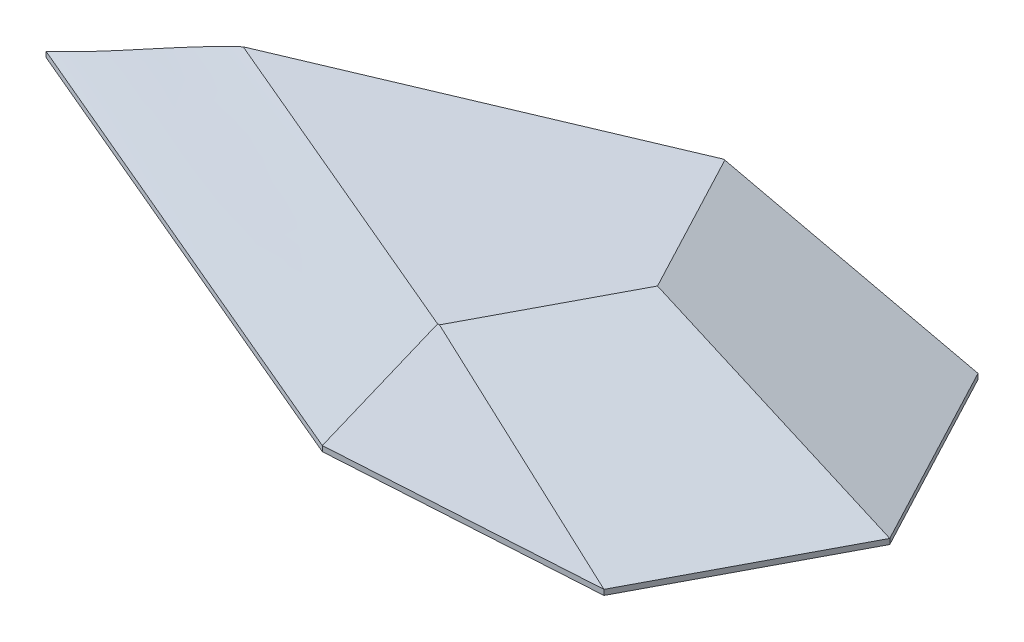
ISO-10303-21;
HEADER;
FILE_DESCRIPTION(('STEP AP214'),'2;1');
FILE_NAME('part.step','',(''),(''),'','','');
FILE_SCHEMA(('AUTOMOTIVE_DESIGN { 1 0 10303 214 1 1 1 1 }'));
ENDSEC;
DATA;
#1=APPLICATION_CONTEXT('core data for automotive mechanical design processes');
#2=APPLICATION_PROTOCOL_DEFINITION('international standard','automotive_design',2000,#1);
#3=PRODUCT_CONTEXT('',#1,'mechanical');
#4=PRODUCT('Part','Part','',(#3));
#5=PRODUCT_RELATED_PRODUCT_CATEGORY('part','',(#4));
#6=PRODUCT_DEFINITION_FORMATION('','',#4);
#7=PRODUCT_DEFINITION_CONTEXT('part definition',#1,'design');
#8=PRODUCT_DEFINITION('design','',#6,#7);
#9=PRODUCT_DEFINITION_SHAPE('','',#8);
#10=(LENGTH_UNIT() NAMED_UNIT(*) SI_UNIT(.MILLI.,.METRE.));
#11=(NAMED_UNIT(*) PLANE_ANGLE_UNIT() SI_UNIT($,.RADIAN.));
#12=(NAMED_UNIT(*) SI_UNIT($,.STERADIAN.) SOLID_ANGLE_UNIT());
#13=UNCERTAINTY_MEASURE_WITH_UNIT(LENGTH_MEASURE(1.E-05),#10,'distance_accuracy_value','');
#14=(GEOMETRIC_REPRESENTATION_CONTEXT(3) GLOBAL_UNCERTAINTY_ASSIGNED_CONTEXT((#13)) GLOBAL_UNIT_ASSIGNED_CONTEXT((#10,
#11,#12)) REPRESENTATION_CONTEXT('',''));
#15=CARTESIAN_POINT('',(0.,0.,0.));
#16=DIRECTION('',(0.,0.,1.));
#17=DIRECTION('',(1.,0.,0.));
#18=AXIS2_PLACEMENT_3D('',#15,#16,#17);
#19=CARTESIAN_POINT('',(362.42570276207,-41.3373029449135,-223.487058966441));
#20=DIRECTION('',(0.0534934352326515,0.486586222198688,-0.871993291690607));
#21=DIRECTION('',(-0.998123619113036,0.,-0.0612310457912873));
#22=AXIS2_PLACEMENT_3D('',#19,#20,#21);
#23=PLANE('',#22);
#24=DIRECTION('',(-0.998123619113036,0.,-0.0612310457912873));
#25=VECTOR('',#24,1.);
#26=CARTESIAN_POINT('',(358.252081405271,81.0426755838166,-155.453106587866));
#27=LINE('',#26,#25);
#28=CARTESIAN_POINT('',(113.027514619091,81.0426755838166,-170.496690759711));
#29=VERTEX_POINT('',#28);
#30=CARTESIAN_POINT('',(110.899403480824,81.0426755838165,-170.627242194484));
#31=VERTEX_POINT('',#30);
#32=EDGE_CURVE('E585',#29,#31,#27,.T.);
#33=ORIENTED_EDGE('',*,*,#32,.F.);
#34=DIRECTION('',(-0.881842315506764,0.432721041163193,0.187367636256402));
#35=VECTOR('',#34,1.);
#36=CARTESIAN_POINT('',(236.883580608468,20.2663611715273,-196.812754201405));
#37=LINE('',#36,#35);
#38=CARTESIAN_POINT('',(362.42570276207,-41.3373029449136,-223.487058966441));
#39=VERTEX_POINT('',#38);
#40=EDGE_CURVE('E484',#39,#29,#37,.T.);
#41=ORIENTED_EDGE('',*,*,#40,.F.);
#42=DIRECTION('',(-0.998123619113036,0.,-0.0612310457912869));
#43=VECTOR('',#42,1.);
#44=CARTESIAN_POINT('',(203.968591934079,-41.3373029449135,-233.207793375758));
#45=LINE('',#44,#43);
#46=CARTESIAN_POINT('',(45.5114811060888,-41.3373029449135,-242.928527785075));
#47=VERTEX_POINT('',#46);
#48=EDGE_CURVE('E635',#39,#47,#45,.T.);
#49=ORIENTED_EDGE('',*,*,#48,.T.);
#50=DIRECTION('',(0.417919448130897,0.782177674890607,0.462105420631149));
#51=VECTOR('',#50,1.);
#52=CARTESIAN_POINT('',(78.4264697804776,20.2663611715273,-206.533488610722));
#53=LINE('',#52,#51);
#54=EDGE_CURVE('E654',#47,#31,#53,.T.);
#55=ORIENTED_EDGE('',*,*,#54,.T.);
#56=EDGE_LOOP('',(#33,#41,#49,#55));
#57=FACE_BOUND('',#56,.T.);
#58=ADVANCED_FACE('F472',(#57),#23,.T.);
#59=CARTESIAN_POINT('',(45.5114811060888,-41.3373029449135,-242.928527785075));
#60=CARTESIAN_POINT('',(67.4548068890146,-0.26819353395294,-218.665168335506));
#61=CARTESIAN_POINT('',(89.3981326719406,40.8009158770076,-194.401808885937));
#62=CARTESIAN_POINT('',(111.341458454867,81.8700252879682,-170.138449436368));
#63=CARTESIAN_POINT('',(-146.441772198282,-41.3373029449135,-161.562351746702));
#64=CARTESIAN_POINT('',(-101.19971153411,-0.0922159086649384,-145.810640965388));
#65=CARTESIAN_POINT('',(-67.5045576860156,41.2000855543382,-128.787343628879));
#66=CARTESIAN_POINT('',(-22.2624970218436,82.4451725905868,-113.035632847564));
#67=CARTESIAN_POINT('',(-338.395025502652,-41.3373029449136,-80.1961757083293));
#68=CARTESIAN_POINT('',(-270.078896235771,0.0878809751256608,-73.0015327638917));
#69=CARTESIAN_POINT('',(-224.182581765434,41.5951359731661,-63.1274592031982));
#70=CARTESIAN_POINT('',(-155.866452498554,83.0203198932053,-55.9328162587606));
#71=CARTESIAN_POINT('',(-530.348278807022,-41.3373029449135,1.17000033004339));
#72=CARTESIAN_POINT('',(-438.988340165455,0.268532662169897,-0.198541853289494));
#73=CARTESIAN_POINT('',(-380.830346616831,41.9896315887404,2.53854251337623));
#74=CARTESIAN_POINT('',(-289.470407975264,83.5954671958239,1.17000033004338));
#75=B_SPLINE_SURFACE_WITH_KNOTS('',3,3,((#59,#60,#61,#62),(#63,#64,#65,#66),(#67,#68,#69,#70),
(#71,#72,#73,#74)),.UNSPECIFIED.,.F.,.F.,.F.,(4,4),(4,4),(0.,1.),(0.,1.),.UNSPECIFIED.);
#76=CARTESIAN_POINT('',(110.899403480824,81.0426755838166,-170.627242194484));
#77=CARTESIAN_POINT('',(87.7890348500212,81.0426755838166,-160.835246797552));
#78=CARTESIAN_POINT('',(64.678184130509,81.0426755838166,-151.044389238637));
#79=CARTESIAN_POINT('',(18.455589116889,81.0426755838165,-131.46478372151));
#80=CARTESIAN_POINT('',(-4.65615517721749,81.0426755838165,-121.676035763294));
#81=CARTESIAN_POINT('',(-50.0390739427923,81.0426755838165,-102.456805146902));
#82=CARTESIAN_POINT('',(-72.3102189969449,81.0426755838165,-93.026253024087));
#83=CARTESIAN_POINT('',(-116.853227402788,81.0426755838166,-74.1668452486426));
#84=CARTESIAN_POINT('',(-139.125090754479,81.0426755838166,-64.7379895960142));
#85=CARTESIAN_POINT('',(-183.669500486234,81.0426755838166,-45.8818904599587));
#86=CARTESIAN_POINT('',(-205.942046866314,81.0426755838166,-36.4546469765675));
#87=CARTESIAN_POINT('',(-250.487800851776,81.0426755838166,-17.6017224351781));
#88=CARTESIAN_POINT('',(-272.761008457157,81.0426755838166,-8.17604137717781));
#89=CARTESIAN_POINT('',(-295.034536050337,81.0426755838166,1.2488834571954));
#90=B_SPLINE_CURVE_WITH_KNOTS('',3,(#76,#77,#78,#79,#80,#81,#82,#83,#84,#85,#86,#87,#88,#89),
.UNSPECIFIED.,.F.,.F.,(4,2,2,2,2,2,4),(0.,75.297747644846,150.595495173112,223.152045034698,
295.708594945292,368.265146467789,440.82169789483),.UNSPECIFIED.);
#91=CARTESIAN_POINT('',(-291.846790189677,81.0426755838165,-0.0999996698296255));
#92=VERTEX_POINT('',#91);
#93=EDGE_CURVE('E597',#31,#92,#90,.T.);
#94=DIRECTION('',(-0.920699932144452,0.,0.390271232541166));
#95=VECTOR('',#94,1.);
#96=CARTESIAN_POINT('',(-242.418398850467,-41.3373029449135,-120.879263727516));
#97=LINE('',#96,#95);
#98=CARTESIAN_POINT('',(-527.35218579189,-41.3373029449135,-0.0999996699566131));
#99=VERTEX_POINT('',#98);
#100=EDGE_CURVE('E650',#47,#99,#97,.T.);
#101=CARTESIAN_POINT('',(-286.498977954968,83.5826755838166,-0.0999996699566207));
#102=CARTESIAN_POINT('',(-289.337557373538,82.2417717446035,-0.0999996699566228));
#103=CARTESIAN_POINT('',(-292.171617321292,80.8913122355324,-0.0999996699566236));
#104=CARTESIAN_POINT('',(-297.83075733858,78.1720316805138,-0.0999996699566243));
#105=CARTESIAN_POINT('',(-300.655837809133,76.8032114692112,-0.099999669956624));
#106=CARTESIAN_POINT('',(-306.29726921497,74.0478698700869,-0.0999996699566239));
#107=CARTESIAN_POINT('',(-309.113620352631,72.661348896503,-0.0999996699566239));
#108=CARTESIAN_POINT('',(-314.737917368916,69.8714100504033,-0.099999669956624));
#109=CARTESIAN_POINT('',(-317.545863299294,68.4679922821956,-0.0999996699566239));
#110=CARTESIAN_POINT('',(-323.15265480242,65.6457190182286,-0.099999669956624));
#111=CARTESIAN_POINT('',(-325.95150341148,64.2268695527513,-0.0999996699566241));
#112=CARTESIAN_POINT('',(-331.541616542959,61.3742527946411,-0.0999996699566238));
#113=CARTESIAN_POINT('',(-334.332880998744,59.9404853714686,-0.0999996699566233));
#114=CARTESIAN_POINT('',(-339.908330365633,57.0592049889799,-0.0999996699566246));
#115=CARTESIAN_POINT('',(-342.692515223967,55.6116919275832,-0.0999996699566264));
#116=CARTESIAN_POINT('',(-348.254375814456,52.7042211538622,-0.0999996699566215));
#117=CARTESIAN_POINT('',(-351.032051547964,51.2442634441225,-0.0999996699566149));
#118=CARTESIAN_POINT('',(-357.505850999344,47.825139547303,-0.0999996699566124));
#119=CARTESIAN_POINT('',(-361.199706718657,45.8616797073128,-0.0999996699566208));
#120=CARTESIAN_POINT('',(-368.578827955461,41.9187422453314,-0.0999996699566271));
#121=CARTESIAN_POINT('',(-372.264093513919,39.9392646999309,-0.0999996699566248));
#122=CARTESIAN_POINT('',(-379.628068614689,35.9682023348251,-0.0999996699566231));
#123=CARTESIAN_POINT('',(-383.306778187115,33.9766175709217,-0.0999996699566236));
#124=CARTESIAN_POINT('',(-390.660210306421,29.9852938321666,-0.0999996699566243));
#125=CARTESIAN_POINT('',(-394.33493245017,27.9855541153322,-0.0999996699566247));
#126=CARTESIAN_POINT('',(-401.682400290076,23.9824183164254,-0.0999996699566232));
#127=CARTESIAN_POINT('',(-405.355145979145,21.9790222213513,-0.0999996699566215));
#128=CARTESIAN_POINT('',(-412.70111400797,17.9729472618005,-0.0999996699566264));
#129=CARTESIAN_POINT('',(-416.374336355213,15.970268411107,-0.0999996699566331));
#130=CARTESIAN_POINT('',(-425.93972162455,10.763875090115,-0.0999996699566371));
#131=CARTESIAN_POINT('',(-431.834106576165,7.56422838178462,-0.0999996699566264));
#132=CARTESIAN_POINT('',(-440.688154784098,2.78797135545785,-0.0999996699566228));
#133=CARTESIAN_POINT('',(-443.641559275978,1.19976697078945,-0.0999996699566236));
#134=CARTESIAN_POINT('',(-449.553608495184,-1.96685595183149,-0.0999996699566243));
#135=CARTESIAN_POINT('',(-452.512253217053,-3.54527449996408,-0.099999669956624));
#136=CARTESIAN_POINT('',(-458.435642510543,-6.69029304012856,-0.0999996699566239));
#137=CARTESIAN_POINT('',(-461.400386788985,-8.25689358405355,-0.0999996699566239));
#138=CARTESIAN_POINT('',(-467.337003780836,-11.3765349505384,-0.099999669956624));
#139=CARTESIAN_POINT('',(-470.308876493506,-12.9295757745036,-0.099999669956624));
#140=CARTESIAN_POINT('',(-476.261104773701,-16.0207334267694,-0.099999669956624));
#141=CARTESIAN_POINT('',(-479.241461867384,-17.558847317595,-0.099999669956624));
#142=CARTESIAN_POINT('',(-485.210747442042,-20.6183501038834,-0.099999669956624));
#143=CARTESIAN_POINT('',(-488.19967591379,-22.1397390173456,-0.0999996699566239));
#144=CARTESIAN_POINT('',(-494.18686060417,-25.1645783300111,-0.099999669956624));
#145=CARTESIAN_POINT('',(-497.185117458325,-26.6680274717172,-0.099999669956624));
#146=CARTESIAN_POINT('',(-503.191173385444,-29.6557391531355,-0.0999996699566239));
#147=CARTESIAN_POINT('',(-506.198972446639,-31.1400017165006,-0.0999996699566237));
#148=CARTESIAN_POINT('',(-512.225114082246,-34.088702184269,-0.0999996699566243));
#149=CARTESIAN_POINT('',(-515.243458876339,-35.5531355537402,-0.0999996699566251));
#150=CARTESIAN_POINT('',(-521.290223133845,-38.4610921083974,-0.0999996699566228));
#151=CARTESIAN_POINT('',(-524.31864265049,-39.9046151828858,-0.0999996699566198));
#152=CARTESIAN_POINT('',(-527.35218579189,-41.3373029449135,-0.0999996699566123));
#153=B_SPLINE_CURVE_WITH_KNOTS('',3,(#101,#102,#103,#104,#105,#106,#107,#108,#109,#110,#111,
#112,#113,#114,#115,#116,#117,#118,#119,#120,#121,#122,#123,#124,#125,#126,#127,#128,#129,#130,
#131,#132,#133,#134,#135,#136,#137,#138,#139,#140,#141,#142,#143,#144,#145,#146,#147,#148,#149,
#150,#151,#152),.UNSPECIFIED.,.F.,.F.,(4,2,2,2,2,2,2,2,2,2,2,2,2,2,2,2,2,2,2,2,2,2,2,2,2,4),(0.,
9.41804301001217,18.8356593337136,28.2530556664616,37.6703938930649,47.0841756222222,
56.4980397960457,65.9119739357458,75.3259061203694,87.8756627158963,100.425359338489,
112.974998163599,125.52580550182,138.076657557197,150.627739085303,170.748158256068,
180.808208941298,190.868249159466,200.927816635317,210.987383068573,221.048890541137,
231.110387184519,241.172584998828,251.234770407436,261.299219436004,271.363721725626),.UNSPECIFIED.);
#154=EDGE_CURVE('E626',#92,#99,#153,.T.);
#155=ORIENTED_EDGE('',*,*,#93,.F.);
#156=ORIENTED_EDGE('',*,*,#54,.F.);
#157=ORIENTED_EDGE('',*,*,#100,.T.);
#158=ORIENTED_EDGE('',*,*,#154,.F.);
#159=EDGE_LOOP('',(#155,#156,#157,#158));
#160=FACE_BOUND('',#159,.T.);
#161=ADVANCED_FACE('F474',(#160),#75,.T.);
#162=CARTESIAN_POINT('',(481.09112908075,-41.3373029449135,1.17000033004338));
#163=DIRECTION('',(0.394774979674853,0.894802165876159,-0.208522898900947));
#164=DIRECTION('',(-0.467055422351651,0.,-0.884228043239933));
#165=AXIS2_PLACEMENT_3D('',#162,#163,#164);
#166=PLANE('',#165);
#167=DIRECTION('',(-0.467055422351651,0.,-0.884228043239933));
#168=VECTOR('',#167,1.);
#169=CARTESIAN_POINT('',(264.212705279997,81.0426755838166,115.726697102593));
#170=LINE('',#169,#168);
#171=CARTESIAN_POINT('',(203.032235836301,81.0426755838166,-0.0999996699566131));
#172=VERTEX_POINT('',#171);
#173=EDGE_CURVE('E577',#172,#29,#170,.T.);
#174=ORIENTED_EDGE('',*,*,#173,.F.);
#175=DIRECTION('',(-0.914914282980682,0.403648181957932,0.));
#176=VECTOR('',#175,1.);
#177=CARTESIAN_POINT('',(480.981830667648,-41.5850401668907,-0.099999669956624));
#178=LINE('',#177,#176);
#179=CARTESIAN_POINT('',(480.420306219022,-41.3373029449136,-0.099999669956624));
#180=VERTEX_POINT('',#179);
#181=EDGE_CURVE('E636',#180,#172,#178,.T.);
#182=ORIENTED_EDGE('',*,*,#181,.F.);
#183=DIRECTION('',(-0.467055422351652,0.,-0.884228043239933));
#184=VECTOR('',#183,1.);
#185=CARTESIAN_POINT('',(421.75841592141,-41.3373029449135,-111.158529318199));
#186=LINE('',#185,#184);
#187=EDGE_CURVE('E646',#180,#39,#186,.T.);
#188=ORIENTED_EDGE('',*,*,#187,.T.);
#189=ORIENTED_EDGE('',*,*,#40,.T.);
#190=EDGE_LOOP('',(#174,#182,#188,#189));
#191=FACE_BOUND('',#190,.T.);
#192=ADVANCED_FACE('F622',(#191),#166,.T.);
#193=CARTESIAN_POINT('',(362.42570276207,-41.3373029449135,223.287059626528));
#194=DIRECTION('',(0.0534934352326515,0.486586222198688,0.871993291690607));
#195=DIRECTION('',(-0.998123619113036,0.,0.0612310457912873));
#196=AXIS2_PLACEMENT_3D('',#193,#194,#195);
#197=PLANE('',#196);
#198=DIRECTION('',(0.998123619113036,0.,-0.0612310457912873));
#199=VECTOR('',#198,1.);
#200=CARTESIAN_POINT('',(358.252081405271,81.0426755838166,155.253107247953));
#201=LINE('',#200,#199);
#202=CARTESIAN_POINT('',(110.899403480824,81.0426755838165,170.427242854571));
#203=VERTEX_POINT('',#202);
#204=CARTESIAN_POINT('',(113.027514619091,81.0426755838166,170.296691419797));
#205=VERTEX_POINT('',#204);
#206=EDGE_CURVE('E490',#203,#205,#201,.T.);
#207=ORIENTED_EDGE('',*,*,#206,.F.);
#208=DIRECTION('',(0.417919448130897,0.782177674890607,-0.462105420631149));
#209=VECTOR('',#208,1.);
#210=CARTESIAN_POINT('',(78.4264697804776,20.2663611715273,206.333489270808));
#211=LINE('',#210,#209);
#212=CARTESIAN_POINT('',(45.5114811060888,-41.3373029449135,242.728528445161));
#213=VERTEX_POINT('',#212);
#214=EDGE_CURVE('E671',#213,#203,#211,.T.);
#215=ORIENTED_EDGE('',*,*,#214,.F.);
#216=DIRECTION('',(-0.998123619113036,0.,0.0612310457912869));
#217=VECTOR('',#216,1.);
#218=CARTESIAN_POINT('',(203.968591934079,-41.3373029449135,233.007794035844));
#219=LINE('',#218,#217);
#220=CARTESIAN_POINT('',(362.42570276207,-41.3373029449136,223.287059626528));
#221=VERTEX_POINT('',#220);
#222=EDGE_CURVE('E637',#221,#213,#219,.T.);
#223=ORIENTED_EDGE('',*,*,#222,.F.);
#224=DIRECTION('',(-0.881842315506764,0.432721041163193,-0.187367636256402));
#225=VECTOR('',#224,1.);
#226=CARTESIAN_POINT('',(236.883580608468,20.2663611715273,196.612754861492));
#227=LINE('',#226,#225);
#228=EDGE_CURVE('E642',#221,#205,#227,.T.);
#229=ORIENTED_EDGE('',*,*,#228,.T.);
#230=EDGE_LOOP('',(#207,#215,#223,#229));
#231=FACE_BOUND('',#230,.T.);
#232=ADVANCED_FACE('F620',(#231),#197,.T.);
#233=CARTESIAN_POINT('',(45.5114811060888,-41.3373029449135,242.728528445161));
#234=CARTESIAN_POINT('',(67.4548068890146,-0.26819353395294,218.465168995593));
#235=CARTESIAN_POINT('',(89.3981326719406,40.8009158770076,194.201809546024));
#236=CARTESIAN_POINT('',(111.341458454867,81.8700252879682,169.938450096455));
#237=CARTESIAN_POINT('',(-146.441772198282,-41.3373029449135,161.362352406789));
#238=CARTESIAN_POINT('',(-101.19971153411,-0.0922159086649384,145.610641625474));
#239=CARTESIAN_POINT('',(-67.5045576860156,41.2000855543382,128.587344288965));
#240=CARTESIAN_POINT('',(-22.2624970218436,82.4451725905868,112.835633507651));
#241=CARTESIAN_POINT('',(-338.395025502652,-41.3373029449136,79.996176368416));
#242=CARTESIAN_POINT('',(-270.078896235771,0.0878809751256608,72.8015334239784));
#243=CARTESIAN_POINT('',(-224.182581765434,41.5951359731661,62.927459863285));
#244=CARTESIAN_POINT('',(-155.866452498554,83.0203198932053,55.7328169188473));
#245=CARTESIAN_POINT('',(-530.348278807022,-41.3373029449135,-1.36999966995663));
#246=CARTESIAN_POINT('',(-438.988340165455,0.268532662169897,-0.00145748662375112));
#247=CARTESIAN_POINT('',(-380.830346616831,41.9896315887404,-2.73854185328947));
#248=CARTESIAN_POINT('',(-289.470407975264,83.5954671958239,-1.36999966995662));
#249=B_SPLINE_SURFACE_WITH_KNOTS('',3,3,((#233,#234,#235,#236),(#237,#238,#239,#240),(#241,#242,
#243,#244),(#245,#246,#247,#248)),.UNSPECIFIED.,.F.,.F.,.F.,(4,4),(4,4),(0.,1.),(0.,1.),.UNSPECIFIED.);
#250=CARTESIAN_POINT('',(-295.034536050333,81.0426755838238,-1.4488827971195));
#251=CARTESIAN_POINT('',(-271.919511938548,81.0426755838191,8.33211751048016));
#252=CARTESIAN_POINT('',(-248.804832113629,81.0426755838173,18.1139314696487));
#253=CARTESIAN_POINT('',(-202.576185419945,81.0426755838159,37.6792440368279));
#254=CARTESIAN_POINT('',(-179.462218551182,81.0426755838164,47.462742644841));
#255=CARTESIAN_POINT('',(-134.076467579578,81.0426755838167,66.6752840452543));
#256=CARTESIAN_POINT('',(-111.804657120436,81.0426755838166,76.1042645760277));
#257=CARTESIAN_POINT('',(-67.2617576147151,81.0426755838165,94.9639294360225));
#258=CARTESIAN_POINT('',(-44.9906685681363,81.0426755838166,104.394613765243));
#259=CARTESIAN_POINT('',(-0.449258272509752,81.0426755838166,123.257797025344));
#260=CARTESIAN_POINT('',(21.8210629765183,81.0426755838166,132.690295956273));
#261=CARTESIAN_POINT('',(66.3608733133934,81.0426755838165,151.557258410087));
#262=CARTESIAN_POINT('',(88.6303624012394,81.0426755838165,160.991721932976));
#263=CARTESIAN_POINT('',(110.899403480824,81.0426755838166,170.427242854571));
#264=B_SPLINE_CURVE_WITH_KNOTS('',3,(#250,#251,#252,#253,#254,#255,#256,#257,#258,#259,#260,
#261,#262,#263),.UNSPECIFIED.,.F.,.F.,(4,2,2,2,2,2,4),(0.,75.2977473709648,150.595494844779,
223.152044687392,295.708594477575,368.26514613424,440.821697896193),.UNSPECIFIED.);
#265=EDGE_CURVE('E588',#92,#203,#264,.T.);
#266=DIRECTION('',(-0.920699932144452,0.,-0.390271232541166));
#267=VECTOR('',#266,1.);
#268=CARTESIAN_POINT('',(-242.418398850467,-41.3373029449135,120.679264387602));
#269=LINE('',#268,#267);
#270=EDGE_CURVE('E675',#213,#99,#269,.T.);
#271=ORIENTED_EDGE('',*,*,#265,.F.);
#272=ORIENTED_EDGE('',*,*,#154,.T.);
#273=ORIENTED_EDGE('',*,*,#270,.F.);
#274=ORIENTED_EDGE('',*,*,#214,.T.);
#275=EDGE_LOOP('',(#271,#272,#273,#274));
#276=FACE_BOUND('',#275,.T.);
#277=ADVANCED_FACE('F603',(#276),#249,.F.);
#278=CARTESIAN_POINT('',(481.09112908075,-41.3373029449135,-1.36999966995662));
#279=DIRECTION('',(0.394774979674853,0.894802165876159,0.208522898900947));
#280=DIRECTION('',(-0.467055422351651,0.,0.884228043239933));
#281=AXIS2_PLACEMENT_3D('',#278,#279,#280);
#282=PLANE('',#281);
#283=DIRECTION('',(0.467055422351651,0.,-0.884228043239933));
#284=VECTOR('',#283,1.);
#285=CARTESIAN_POINT('',(264.212705279997,81.0426755838166,-115.926696442506));
#286=LINE('',#285,#284);
#287=EDGE_CURVE('E14',#205,#172,#286,.T.);
#288=ORIENTED_EDGE('',*,*,#287,.F.);
#289=ORIENTED_EDGE('',*,*,#228,.F.);
#290=DIRECTION('',(-0.467055422351652,0.,0.884228043239933));
#291=VECTOR('',#290,1.);
#292=CARTESIAN_POINT('',(421.75841592141,-41.3373029449135,110.958529978286));
#293=LINE('',#292,#291);
#294=EDGE_CURVE('E571',#180,#221,#293,.T.);
#295=ORIENTED_EDGE('',*,*,#294,.F.);
#296=ORIENTED_EDGE('',*,*,#181,.T.);
#297=EDGE_LOOP('',(#288,#289,#295,#296));
#298=FACE_BOUND('',#297,.T.);
#299=ADVANCED_FACE('F614',(#298),#282,.T.);
#300=CARTESIAN_POINT('',(-530.348278807022,81.0426755838166,1.17000033004338));
#301=DIRECTION('',(0.,-1.,0.));
#302=DIRECTION('',(0.,0.,-1.));
#303=AXIS2_PLACEMENT_3D('',#300,#301,#302);
#304=PLANE('',#303);
#305=ORIENTED_EDGE('',*,*,#93,.T.);
#306=ORIENTED_EDGE('',*,*,#265,.T.);
#307=ORIENTED_EDGE('',*,*,#206,.T.);
#308=ORIENTED_EDGE('',*,*,#287,.T.);
#309=ORIENTED_EDGE('',*,*,#173,.T.);
#310=ORIENTED_EDGE('',*,*,#32,.T.);
#311=EDGE_LOOP('',(#305,#306,#307,#308,#309,#310));
#312=FACE_BOUND('',#311,.T.);
#313=ADVANCED_FACE('F609',(#312),#304,.F.);
#314=CARTESIAN_POINT('',(480.420306219022,-47.6873029449135,-0.099999669956624));
#315=DIRECTION('',(-0.884228043239933,0.,-0.467055422351652));
#316=DIRECTION('',(-0.467055422351652,0.,0.884228043239933));
#317=AXIS2_PLACEMENT_3D('',#314,#315,#316);
#318=PLANE('',#317);
#319=ORIENTED_EDGE('',*,*,#294,.T.);
#320=DIRECTION('',(0.,1.,0.));
#321=VECTOR('',#320,1.);
#322=CARTESIAN_POINT('',(362.42570276207,-47.6873029449135,223.287059626528));
#323=LINE('',#322,#321);
#324=CARTESIAN_POINT('',(362.42570276207,-47.6873029449135,223.287059626528));
#325=VERTEX_POINT('',#324);
#326=EDGE_CURVE('E550',#325,#221,#323,.T.);
#327=ORIENTED_EDGE('',*,*,#326,.F.);
#328=DIRECTION('',(-0.467055422351652,0.,0.884228043239933));
#329=VECTOR('',#328,1.);
#330=CARTESIAN_POINT('',(480.420306219022,-47.6873029449135,-0.099999669956624));
#331=LINE('',#330,#329);
#332=CARTESIAN_POINT('',(480.420306219022,-47.6873029449135,-0.099999669956624));
#333=VERTEX_POINT('',#332);
#334=EDGE_CURVE('E558',#333,#325,#331,.T.);
#335=ORIENTED_EDGE('',*,*,#334,.F.);
#336=DIRECTION('',(0.,1.,0.));
#337=VECTOR('',#336,1.);
#338=CARTESIAN_POINT('',(480.420306219022,-47.6873029449135,-0.099999669956624));
#339=LINE('',#338,#337);
#340=EDGE_CURVE('E690',#333,#180,#339,.T.);
#341=ORIENTED_EDGE('',*,*,#340,.T.);
#342=EDGE_LOOP('',(#319,#327,#335,#341));
#343=FACE_BOUND('',#342,.T.);
#344=ADVANCED_FACE('F569',(#343),#318,.F.);
#345=CARTESIAN_POINT('',(362.42570276207,-47.6873029449135,223.287059626528));
#346=DIRECTION('',(-0.0612310457912873,0.,-0.998123619113036));
#347=DIRECTION('',(-0.998123619113036,0.,0.0612310457912873));
#348=AXIS2_PLACEMENT_3D('',#345,#346,#347);
#349=PLANE('',#348);
#350=ORIENTED_EDGE('',*,*,#222,.T.);
#351=DIRECTION('',(0.,1.,0.));
#352=VECTOR('',#351,1.);
#353=CARTESIAN_POINT('',(45.5114811060888,-47.6873029449135,242.728528445161));
#354=LINE('',#353,#352);
#355=CARTESIAN_POINT('',(45.5114811060888,-47.6873029449135,242.728528445161));
#356=VERTEX_POINT('',#355);
#357=EDGE_CURVE('E553',#356,#213,#354,.T.);
#358=ORIENTED_EDGE('',*,*,#357,.F.);
#359=DIRECTION('',(-0.998123619113036,0.,0.0612310457912873));
#360=VECTOR('',#359,1.);
#361=CARTESIAN_POINT('',(362.42570276207,-47.6873029449135,223.287059626528));
#362=LINE('',#361,#360);
#363=EDGE_CURVE('E546',#325,#356,#362,.T.);
#364=ORIENTED_EDGE('',*,*,#363,.F.);
#365=ORIENTED_EDGE('',*,*,#326,.T.);
#366=EDGE_LOOP('',(#350,#358,#364,#365));
#367=FACE_BOUND('',#366,.T.);
#368=ADVANCED_FACE('F548',(#367),#349,.F.);
#369=CARTESIAN_POINT('',(45.5114811060888,-47.6873029449135,242.728528445161));
#370=DIRECTION('',(0.390271232541166,0.,-0.920699932144452));
#371=DIRECTION('',(-0.920699932144452,0.,-0.390271232541166));
#372=AXIS2_PLACEMENT_3D('',#369,#370,#371);
#373=PLANE('',#372);
#374=ORIENTED_EDGE('',*,*,#270,.T.);
#375=DIRECTION('',(0.,1.,0.));
#376=VECTOR('',#375,1.);
#377=CARTESIAN_POINT('',(-527.35218579189,-47.6873029449135,-0.0999996699566131));
#378=LINE('',#377,#376);
#379=CARTESIAN_POINT('',(-527.35218579189,-47.6873029449135,-0.0999996699566131));
#380=VERTEX_POINT('',#379);
#381=EDGE_CURVE('E579',#380,#99,#378,.T.);
#382=ORIENTED_EDGE('',*,*,#381,.F.);
#383=DIRECTION('',(-0.920699932144452,0.,-0.390271232541166));
#384=VECTOR('',#383,1.);
#385=CARTESIAN_POINT('',(45.5114811060888,-47.6873029449135,242.728528445161));
#386=LINE('',#385,#384);
#387=EDGE_CURVE('E557',#356,#380,#386,.T.);
#388=ORIENTED_EDGE('',*,*,#387,.F.);
#389=ORIENTED_EDGE('',*,*,#357,.T.);
#390=EDGE_LOOP('',(#374,#382,#388,#389));
#391=FACE_BOUND('',#390,.T.);
#392=ADVANCED_FACE('F710',(#391),#373,.F.);
#393=CARTESIAN_POINT('',(45.5114811060888,-47.6873029449135,-242.928527785075));
#394=DIRECTION('',(0.390271232541166,0.,0.920699932144452));
#395=DIRECTION('',(0.920699932144452,0.,-0.390271232541166));
#396=AXIS2_PLACEMENT_3D('',#393,#394,#395);
#397=PLANE('',#396);
#398=ORIENTED_EDGE('',*,*,#100,.F.);
#399=DIRECTION('',(0.,1.,0.));
#400=VECTOR('',#399,1.);
#401=CARTESIAN_POINT('',(45.5114811060888,-47.6873029449135,-242.928527785075));
#402=LINE('',#401,#400);
#403=CARTESIAN_POINT('',(45.5114811060888,-47.6873029449135,-242.928527785075));
#404=VERTEX_POINT('',#403);
#405=EDGE_CURVE('E498',#404,#47,#402,.T.);
#406=ORIENTED_EDGE('',*,*,#405,.F.);
#407=DIRECTION('',(0.920699932144452,0.,-0.390271232541166));
#408=VECTOR('',#407,1.);
#409=CARTESIAN_POINT('',(45.5114811060888,-47.6873029449135,-242.928527785075));
#410=LINE('',#409,#408);
#411=EDGE_CURVE('E708',#380,#404,#410,.T.);
#412=ORIENTED_EDGE('',*,*,#411,.F.);
#413=ORIENTED_EDGE('',*,*,#381,.T.);
#414=EDGE_LOOP('',(#398,#406,#412,#413));
#415=FACE_BOUND('',#414,.T.);
#416=ADVANCED_FACE('F707',(#415),#397,.F.);
#417=CARTESIAN_POINT('',(362.42570276207,-47.6873029449135,-223.487058966441));
#418=DIRECTION('',(-0.0612310457912873,0.,0.998123619113036));
#419=DIRECTION('',(0.998123619113036,0.,0.0612310457912873));
#420=AXIS2_PLACEMENT_3D('',#417,#418,#419);
#421=PLANE('',#420);
#422=ORIENTED_EDGE('',*,*,#48,.F.);
#423=DIRECTION('',(0.,1.,0.));
#424=VECTOR('',#423,1.);
#425=CARTESIAN_POINT('',(362.42570276207,-47.6873029449135,-223.487058966441));
#426=LINE('',#425,#424);
#427=CARTESIAN_POINT('',(362.42570276207,-47.6873029449135,-223.487058966441));
#428=VERTEX_POINT('',#427);
#429=EDGE_CURVE('E691',#428,#39,#426,.T.);
#430=ORIENTED_EDGE('',*,*,#429,.F.);
#431=DIRECTION('',(0.998123619113036,0.,0.0612310457912873));
#432=VECTOR('',#431,1.);
#433=CARTESIAN_POINT('',(362.42570276207,-47.6873029449135,-223.487058966441));
#434=LINE('',#433,#432);
#435=EDGE_CURVE('E697',#404,#428,#434,.T.);
#436=ORIENTED_EDGE('',*,*,#435,.F.);
#437=ORIENTED_EDGE('',*,*,#405,.T.);
#438=EDGE_LOOP('',(#422,#430,#436,#437));
#439=FACE_BOUND('',#438,.T.);
#440=ADVANCED_FACE('F716',(#439),#421,.F.);
#441=CARTESIAN_POINT('',(480.420306219022,-47.6873029449135,-0.099999669956624));
#442=DIRECTION('',(-0.884228043239933,0.,0.467055422351652));
#443=DIRECTION('',(0.467055422351652,0.,0.884228043239933));
#444=AXIS2_PLACEMENT_3D('',#441,#442,#443);
#445=PLANE('',#444);
#446=ORIENTED_EDGE('',*,*,#187,.F.);
#447=ORIENTED_EDGE('',*,*,#340,.F.);
#448=DIRECTION('',(0.467055422351652,0.,0.884228043239933));
#449=VECTOR('',#448,1.);
#450=CARTESIAN_POINT('',(480.420306219022,-47.6873029449135,-0.099999669956624));
#451=LINE('',#450,#449);
#452=EDGE_CURVE('E563',#428,#333,#451,.T.);
#453=ORIENTED_EDGE('',*,*,#452,.F.);
#454=ORIENTED_EDGE('',*,*,#429,.T.);
#455=EDGE_LOOP('',(#446,#447,#453,#454));
#456=FACE_BOUND('',#455,.T.);
#457=ADVANCED_FACE('F689',(#456),#445,.F.);
#458=CARTESIAN_POINT('',(-530.348278807022,-47.6873029449135,1.17000033004338));
#459=DIRECTION('',(0.,-1.,0.));
#460=DIRECTION('',(1.,0.,0.));
#461=AXIS2_PLACEMENT_3D('',#458,#459,#460);
#462=PLANE('',#461);
#463=ORIENTED_EDGE('',*,*,#334,.T.);
#464=ORIENTED_EDGE('',*,*,#363,.T.);
#465=ORIENTED_EDGE('',*,*,#387,.T.);
#466=ORIENTED_EDGE('',*,*,#411,.T.);
#467=ORIENTED_EDGE('',*,*,#435,.T.);
#468=ORIENTED_EDGE('',*,*,#452,.T.);
#469=EDGE_LOOP('',(#463,#464,#465,#466,#467,#468));
#470=FACE_BOUND('',#469,.T.);
#471=ADVANCED_FACE('F561',(#470),#462,.T.);
#472=CLOSED_SHELL('',(#58,#161,#192,#232,#277,#299,#313,#344,#368,#392,#416,#440,#457,#471));
#473=MANIFOLD_SOLID_BREP('B2',#472);
#474=ADVANCED_BREP_SHAPE_REPRESENTATION('',(#18,#473),#14);
#475=SHAPE_DEFINITION_REPRESENTATION(#9,#474);
ENDSEC;
END-ISO-10303-21;
